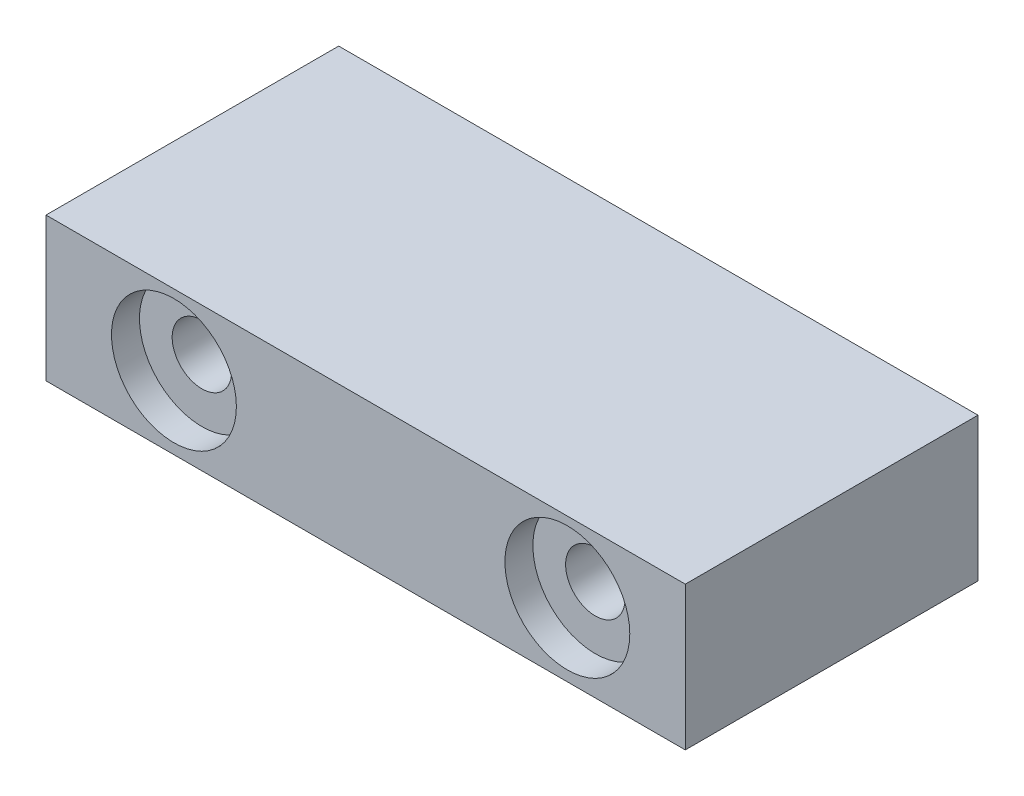
ISO-10303-21;
HEADER;
FILE_DESCRIPTION(('STEP AP214'),'2;1');
FILE_NAME('part.step','',(''),(''),'','','');
FILE_SCHEMA(('AUTOMOTIVE_DESIGN { 1 0 10303 214 1 1 1 1 }'));
ENDSEC;
DATA;
#1=APPLICATION_CONTEXT('core data for automotive mechanical design processes');
#2=APPLICATION_PROTOCOL_DEFINITION('international standard','automotive_design',2000,#1);
#3=PRODUCT_CONTEXT('',#1,'mechanical');
#4=PRODUCT('Part','Part','',(#3));
#5=PRODUCT_RELATED_PRODUCT_CATEGORY('part','',(#4));
#6=PRODUCT_DEFINITION_FORMATION('','',#4);
#7=PRODUCT_DEFINITION_CONTEXT('part definition',#1,'design');
#8=PRODUCT_DEFINITION('design','',#6,#7);
#9=PRODUCT_DEFINITION_SHAPE('','',#8);
#10=(LENGTH_UNIT() NAMED_UNIT(*) SI_UNIT(.MILLI.,.METRE.));
#11=(NAMED_UNIT(*) PLANE_ANGLE_UNIT() SI_UNIT($,.RADIAN.));
#12=(NAMED_UNIT(*) SI_UNIT($,.STERADIAN.) SOLID_ANGLE_UNIT());
#13=UNCERTAINTY_MEASURE_WITH_UNIT(LENGTH_MEASURE(1.E-05),#10,'distance_accuracy_value','');
#14=(GEOMETRIC_REPRESENTATION_CONTEXT(3) GLOBAL_UNCERTAINTY_ASSIGNED_CONTEXT((#13)) GLOBAL_UNIT_ASSIGNED_CONTEXT((#10,
#11,#12)) REPRESENTATION_CONTEXT('',''));
#15=CARTESIAN_POINT('',(0.,0.,0.));
#16=DIRECTION('',(0.,0.,1.));
#17=DIRECTION('',(1.,0.,0.));
#18=AXIS2_PLACEMENT_3D('',#15,#16,#17);
#19=CARTESIAN_POINT('',(-8.125,3.65,7.44));
#20=DIRECTION('',(0.,-1.,0.));
#21=DIRECTION('',(0.,0.,-1.));
#22=AXIS2_PLACEMENT_3D('',#19,#20,#21);
#23=PLANE('',#22);
#24=DIRECTION('',(-1.,0.,0.));
#25=VECTOR('',#24,1.);
#26=CARTESIAN_POINT('',(-8.125,3.65,0.));
#27=LINE('',#26,#25);
#28=CARTESIAN_POINT('',(8.125,3.65,0.));
#29=VERTEX_POINT('',#28);
#30=CARTESIAN_POINT('',(-8.125,3.65,0.));
#31=VERTEX_POINT('',#30);
#32=EDGE_CURVE('E135',#29,#31,#27,.T.);
#33=ORIENTED_EDGE('',*,*,#32,.T.);
#34=DIRECTION('',(0.,0.,-1.));
#35=VECTOR('',#34,1.);
#36=CARTESIAN_POINT('',(-8.125,3.65,7.44));
#37=LINE('',#36,#35);
#38=CARTESIAN_POINT('',(-8.125,3.65,7.44));
#39=VERTEX_POINT('',#38);
#40=EDGE_CURVE('E11',#39,#31,#37,.T.);
#41=ORIENTED_EDGE('',*,*,#40,.F.);
#42=DIRECTION('',(-1.,0.,0.));
#43=VECTOR('',#42,1.);
#44=CARTESIAN_POINT('',(-8.125,3.65,7.44));
#45=LINE('',#44,#43);
#46=CARTESIAN_POINT('',(8.125,3.65,7.44));
#47=VERTEX_POINT('',#46);
#48=EDGE_CURVE('E136',#47,#39,#45,.T.);
#49=ORIENTED_EDGE('',*,*,#48,.F.);
#50=DIRECTION('',(0.,0.,-1.));
#51=VECTOR('',#50,1.);
#52=CARTESIAN_POINT('',(8.125,3.65,7.44));
#53=LINE('',#52,#51);
#54=EDGE_CURVE('E146',#47,#29,#53,.T.);
#55=ORIENTED_EDGE('',*,*,#54,.T.);
#56=EDGE_LOOP('',(#33,#41,#49,#55));
#57=FACE_BOUND('',#56,.T.);
#58=ADVANCED_FACE('F45',(#57),#23,.F.);
#59=CARTESIAN_POINT('',(-8.125,3.65,7.44));
#60=DIRECTION('',(1.,0.,0.));
#61=DIRECTION('',(0.,0.,-1.));
#62=AXIS2_PLACEMENT_3D('',#59,#60,#61);
#63=PLANE('',#62);
#64=DIRECTION('',(0.,-1.,0.));
#65=VECTOR('',#64,1.);
#66=CARTESIAN_POINT('',(-8.125,3.65,0.));
#67=LINE('',#66,#65);
#68=CARTESIAN_POINT('',(-8.125,0.,0.));
#69=VERTEX_POINT('',#68);
#70=EDGE_CURVE('E150',#31,#69,#67,.T.);
#71=ORIENTED_EDGE('',*,*,#70,.T.);
#72=DIRECTION('',(0.,0.,-1.));
#73=VECTOR('',#72,1.);
#74=CARTESIAN_POINT('',(-8.125,0.,7.44));
#75=LINE('',#74,#73);
#76=CARTESIAN_POINT('',(-8.125,0.,7.44));
#77=VERTEX_POINT('',#76);
#78=EDGE_CURVE('E54',#77,#69,#75,.T.);
#79=ORIENTED_EDGE('',*,*,#78,.F.);
#80=DIRECTION('',(0.,-1.,0.));
#81=VECTOR('',#80,1.);
#82=CARTESIAN_POINT('',(-8.125,3.65,7.44));
#83=LINE('',#82,#81);
#84=EDGE_CURVE('E93',#39,#77,#83,.T.);
#85=ORIENTED_EDGE('',*,*,#84,.F.);
#86=ORIENTED_EDGE('',*,*,#40,.T.);
#87=EDGE_LOOP('',(#71,#79,#85,#86));
#88=FACE_BOUND('',#87,.T.);
#89=ADVANCED_FACE('F180',(#88),#63,.F.);
#90=CARTESIAN_POINT('',(-8.125,0.,7.44));
#91=DIRECTION('',(0.,1.,0.));
#92=DIRECTION('',(0.,0.,1.));
#93=AXIS2_PLACEMENT_3D('',#90,#91,#92);
#94=PLANE('',#93);
#95=DIRECTION('',(1.,0.,0.));
#96=VECTOR('',#95,1.);
#97=CARTESIAN_POINT('',(-8.125,0.,0.));
#98=LINE('',#97,#96);
#99=CARTESIAN_POINT('',(8.125,0.,0.));
#100=VERTEX_POINT('',#99);
#101=EDGE_CURVE('E80',#69,#100,#98,.T.);
#102=ORIENTED_EDGE('',*,*,#101,.T.);
#103=DIRECTION('',(0.,0.,-1.));
#104=VECTOR('',#103,1.);
#105=CARTESIAN_POINT('',(8.125,0.,7.44));
#106=LINE('',#105,#104);
#107=CARTESIAN_POINT('',(8.125,0.,7.44));
#108=VERTEX_POINT('',#107);
#109=EDGE_CURVE('E159',#108,#100,#106,.T.);
#110=ORIENTED_EDGE('',*,*,#109,.F.);
#111=DIRECTION('',(1.,0.,0.));
#112=VECTOR('',#111,1.);
#113=CARTESIAN_POINT('',(-8.125,0.,7.44));
#114=LINE('',#113,#112);
#115=EDGE_CURVE('E141',#77,#108,#114,.T.);
#116=ORIENTED_EDGE('',*,*,#115,.F.);
#117=ORIENTED_EDGE('',*,*,#78,.T.);
#118=EDGE_LOOP('',(#102,#110,#116,#117));
#119=FACE_BOUND('',#118,.T.);
#120=ADVANCED_FACE('F163',(#119),#94,.F.);
#121=CARTESIAN_POINT('',(8.125,3.65,7.44));
#122=DIRECTION('',(-1.,0.,0.));
#123=DIRECTION('',(0.,0.,1.));
#124=AXIS2_PLACEMENT_3D('',#121,#122,#123);
#125=PLANE('',#124);
#126=DIRECTION('',(0.,1.,0.));
#127=VECTOR('',#126,1.);
#128=CARTESIAN_POINT('',(8.125,3.65,0.));
#129=LINE('',#128,#127);
#130=EDGE_CURVE('E86',#100,#29,#129,.T.);
#131=ORIENTED_EDGE('',*,*,#130,.T.);
#132=ORIENTED_EDGE('',*,*,#54,.F.);
#133=DIRECTION('',(0.,1.,0.));
#134=VECTOR('',#133,1.);
#135=CARTESIAN_POINT('',(8.125,3.65,7.44));
#136=LINE('',#135,#134);
#137=EDGE_CURVE('E62',#108,#47,#136,.T.);
#138=ORIENTED_EDGE('',*,*,#137,.F.);
#139=ORIENTED_EDGE('',*,*,#109,.T.);
#140=EDGE_LOOP('',(#131,#132,#138,#139));
#141=FACE_BOUND('',#140,.T.);
#142=ADVANCED_FACE('F170',(#141),#125,.F.);
#143=CARTESIAN_POINT('',(0.,0.,7.44));
#144=DIRECTION('',(0.,0.,-1.));
#145=DIRECTION('',(-1.,0.,0.));
#146=AXIS2_PLACEMENT_3D('',#143,#144,#145);
#147=PLANE('',#146);
#148=CARTESIAN_POINT('',(-4.87325948348779,1.85,7.44));
#149=DIRECTION('',(0.,0.,1.));
#150=DIRECTION('',(1.,0.,0.));
#151=AXIS2_PLACEMENT_3D('',#148,#149,#150);
#152=CIRCLE('',#151,1.5875);
#153=CARTESIAN_POINT('',(-3.28575948348779,1.85,7.44));
#154=VERTEX_POINT('',#153);
#155=EDGE_CURVE('E354',#154,#154,#152,.T.);
#156=ORIENTED_EDGE('',*,*,#155,.F.);
#157=EDGE_LOOP('',(#156));
#158=FACE_BOUND('',#157,.T.);
#159=CARTESIAN_POINT('',(5.12674051651221,1.85,7.44));
#160=DIRECTION('',(0.,0.,1.));
#161=DIRECTION('',(1.,0.,0.));
#162=AXIS2_PLACEMENT_3D('',#159,#160,#161);
#163=CIRCLE('',#162,1.5875);
#164=CARTESIAN_POINT('',(6.71424051651221,1.85,7.44));
#165=VERTEX_POINT('',#164);
#166=EDGE_CURVE('E111',#165,#165,#163,.T.);
#167=ORIENTED_EDGE('',*,*,#166,.F.);
#168=EDGE_LOOP('',(#167));
#169=FACE_BOUND('',#168,.T.);
#170=ORIENTED_EDGE('',*,*,#48,.T.);
#171=ORIENTED_EDGE('',*,*,#84,.T.);
#172=ORIENTED_EDGE('',*,*,#115,.T.);
#173=ORIENTED_EDGE('',*,*,#137,.T.);
#174=EDGE_LOOP('',(#170,#171,#172,#173));
#175=FACE_BOUND('',#174,.T.);
#176=ADVANCED_FACE('F172',(#158,#169,#175),#147,.F.);
#177=CARTESIAN_POINT('',(0.,0.,0.));
#178=DIRECTION('',(0.,0.,-1.));
#179=DIRECTION('',(-1.,0.,0.));
#180=AXIS2_PLACEMENT_3D('',#177,#178,#179);
#181=PLANE('',#180);
#182=ORIENTED_EDGE('',*,*,#32,.F.);
#183=ORIENTED_EDGE('',*,*,#130,.F.);
#184=ORIENTED_EDGE('',*,*,#101,.F.);
#185=ORIENTED_EDGE('',*,*,#70,.F.);
#186=EDGE_LOOP('',(#182,#183,#184,#185));
#187=FACE_BOUND('',#186,.T.);
#188=ADVANCED_FACE('F166',(#187),#181,.T.);
#189=CARTESIAN_POINT('',(5.12674051651221,1.85,2.44));
#190=DIRECTION('',(0.,0.,1.));
#191=DIRECTION('',(1.,0.,0.));
#192=AXIS2_PLACEMENT_3D('',#189,#190,#191);
#193=CONICAL_SURFACE('',#192,0.755649999999998,1.02974425867665);
#194=CARTESIAN_POINT('',(5.12674051651221,1.85,1.98595967323182));
#195=VERTEX_POINT('',#194);
#196=VERTEX_LOOP('',#195);
#197=FACE_BOUND('',#196,.T.);
#198=CARTESIAN_POINT('',(5.12674051651221,1.85,2.44));
#199=DIRECTION('',(0.,0.,1.));
#200=DIRECTION('',(1.,0.,0.));
#201=AXIS2_PLACEMENT_3D('',#198,#199,#200);
#202=CIRCLE('',#201,0.755649999999998);
#203=CARTESIAN_POINT('',(5.88239051651221,1.85,2.44));
#204=VERTEX_POINT('',#203);
#205=EDGE_CURVE('E131',#204,#204,#202,.T.);
#206=ORIENTED_EDGE('',*,*,#205,.T.);
#207=EDGE_LOOP('',(#206));
#208=FACE_BOUND('',#207,.T.);
#209=ADVANCED_FACE('F213',(#197,#208),#193,.F.);
#210=CARTESIAN_POINT('',(5.12674051651221,1.85,7.44));
#211=DIRECTION('',(0.,0.,1.));
#212=DIRECTION('',(1.,0.,0.));
#213=AXIS2_PLACEMENT_3D('',#210,#211,#212);
#214=CYLINDRICAL_SURFACE('',#213,0.755649999999999);
#215=ORIENTED_EDGE('',*,*,#205,.F.);
#216=EDGE_LOOP('',(#215));
#217=FACE_BOUND('',#216,.T.);
#218=CARTESIAN_POINT('',(5.12674051651221,1.85,6.7288));
#219=DIRECTION('',(0.,0.,1.));
#220=DIRECTION('',(1.,0.,0.));
#221=AXIS2_PLACEMENT_3D('',#218,#219,#220);
#222=CIRCLE('',#221,0.755649999999999);
#223=CARTESIAN_POINT('',(5.88239051651221,1.85,6.7288));
#224=VERTEX_POINT('',#223);
#225=EDGE_CURVE('E127',#224,#224,#222,.T.);
#226=ORIENTED_EDGE('',*,*,#225,.T.);
#227=EDGE_LOOP('',(#226));
#228=FACE_BOUND('',#227,.T.);
#229=ADVANCED_FACE('F220',(#217,#228),#214,.F.);
#230=CARTESIAN_POINT('',(5.88239051651221,1.85,6.7288));
#231=DIRECTION('',(0.,0.,-1.));
#232=DIRECTION('',(-1.,0.,0.));
#233=AXIS2_PLACEMENT_3D('',#230,#231,#232);
#234=PLANE('',#233);
#235=ORIENTED_EDGE('',*,*,#225,.F.);
#236=EDGE_LOOP('',(#235));
#237=FACE_BOUND('',#236,.T.);
#238=CARTESIAN_POINT('',(5.12674051651221,1.85,6.7288));
#239=DIRECTION('',(0.,0.,1.));
#240=DIRECTION('',(1.,0.,0.));
#241=AXIS2_PLACEMENT_3D('',#238,#239,#240);
#242=CIRCLE('',#241,1.5875);
#243=CARTESIAN_POINT('',(6.71424051651221,1.85,6.7288));
#244=VERTEX_POINT('',#243);
#245=EDGE_CURVE('E117',#244,#244,#242,.T.);
#246=ORIENTED_EDGE('',*,*,#245,.T.);
#247=EDGE_LOOP('',(#246));
#248=FACE_BOUND('',#247,.T.);
#249=ADVANCED_FACE('F230',(#237,#248),#234,.F.);
#250=CARTESIAN_POINT('',(5.12674051651221,1.85,7.44));
#251=DIRECTION('',(0.,0.,1.));
#252=DIRECTION('',(1.,0.,0.));
#253=AXIS2_PLACEMENT_3D('',#250,#251,#252);
#254=CYLINDRICAL_SURFACE('',#253,1.5875);
#255=ORIENTED_EDGE('',*,*,#245,.F.);
#256=EDGE_LOOP('',(#255));
#257=FACE_BOUND('',#256,.T.);
#258=ORIENTED_EDGE('',*,*,#166,.T.);
#259=EDGE_LOOP('',(#258));
#260=FACE_BOUND('',#259,.T.);
#261=ADVANCED_FACE('F104',(#257,#260),#254,.F.);
#262=CARTESIAN_POINT('',(-4.87325948348779,1.85,2.44));
#263=DIRECTION('',(0.,0.,1.));
#264=DIRECTION('',(1.,0.,0.));
#265=AXIS2_PLACEMENT_3D('',#262,#263,#264);
#266=CONICAL_SURFACE('',#265,0.755649999999998,1.02974425867665);
#267=CARTESIAN_POINT('',(-4.87325948348779,1.85,1.98595967323182));
#268=VERTEX_POINT('',#267);
#269=VERTEX_LOOP('',#268);
#270=FACE_BOUND('',#269,.T.);
#271=CARTESIAN_POINT('',(-4.87325948348779,1.85,2.44));
#272=DIRECTION('',(0.,0.,1.));
#273=DIRECTION('',(1.,0.,0.));
#274=AXIS2_PLACEMENT_3D('',#271,#272,#273);
#275=CIRCLE('',#274,0.755649999999998);
#276=CARTESIAN_POINT('',(-4.11760948348779,1.85,2.44));
#277=VERTEX_POINT('',#276);
#278=EDGE_CURVE('E108',#277,#277,#275,.T.);
#279=ORIENTED_EDGE('',*,*,#278,.T.);
#280=EDGE_LOOP('',(#279));
#281=FACE_BOUND('',#280,.T.);
#282=ADVANCED_FACE('F100',(#270,#281),#266,.F.);
#283=CARTESIAN_POINT('',(-4.87325948348779,1.85,7.44));
#284=DIRECTION('',(0.,0.,1.));
#285=DIRECTION('',(1.,0.,0.));
#286=AXIS2_PLACEMENT_3D('',#283,#284,#285);
#287=CYLINDRICAL_SURFACE('',#286,0.755649999999999);
#288=ORIENTED_EDGE('',*,*,#278,.F.);
#289=EDGE_LOOP('',(#288));
#290=FACE_BOUND('',#289,.T.);
#291=CARTESIAN_POINT('',(-4.87325948348779,1.85,6.7288));
#292=DIRECTION('',(0.,0.,1.));
#293=DIRECTION('',(1.,0.,0.));
#294=AXIS2_PLACEMENT_3D('',#291,#292,#293);
#295=CIRCLE('',#294,0.755649999999999);
#296=CARTESIAN_POINT('',(-4.11760948348779,1.85,6.7288));
#297=VERTEX_POINT('',#296);
#298=EDGE_CURVE('E112',#297,#297,#295,.T.);
#299=ORIENTED_EDGE('',*,*,#298,.T.);
#300=EDGE_LOOP('',(#299));
#301=FACE_BOUND('',#300,.T.);
#302=ADVANCED_FACE('F103',(#290,#301),#287,.F.);
#303=CARTESIAN_POINT('',(-4.11760948348779,1.85,6.7288));
#304=DIRECTION('',(0.,0.,-1.));
#305=DIRECTION('',(-1.,0.,0.));
#306=AXIS2_PLACEMENT_3D('',#303,#304,#305);
#307=PLANE('',#306);
#308=ORIENTED_EDGE('',*,*,#298,.F.);
#309=EDGE_LOOP('',(#308));
#310=FACE_BOUND('',#309,.T.);
#311=CARTESIAN_POINT('',(-4.87325948348779,1.85,6.7288));
#312=DIRECTION('',(0.,0.,1.));
#313=DIRECTION('',(1.,0.,0.));
#314=AXIS2_PLACEMENT_3D('',#311,#312,#313);
#315=CIRCLE('',#314,1.5875);
#316=CARTESIAN_POINT('',(-3.28575948348779,1.85,6.7288));
#317=VERTEX_POINT('',#316);
#318=EDGE_CURVE('E120',#317,#317,#315,.T.);
#319=ORIENTED_EDGE('',*,*,#318,.T.);
#320=EDGE_LOOP('',(#319));
#321=FACE_BOUND('',#320,.T.);
#322=ADVANCED_FACE('F264',(#310,#321),#307,.F.);
#323=CARTESIAN_POINT('',(-4.87325948348779,1.85,7.44));
#324=DIRECTION('',(0.,0.,1.));
#325=DIRECTION('',(1.,0.,0.));
#326=AXIS2_PLACEMENT_3D('',#323,#324,#325);
#327=CYLINDRICAL_SURFACE('',#326,1.5875);
#328=ORIENTED_EDGE('',*,*,#318,.F.);
#329=EDGE_LOOP('',(#328));
#330=FACE_BOUND('',#329,.T.);
#331=ORIENTED_EDGE('',*,*,#155,.T.);
#332=EDGE_LOOP('',(#331));
#333=FACE_BOUND('',#332,.T.);
#334=ADVANCED_FACE('F273',(#330,#333),#327,.F.);
#335=CLOSED_SHELL('',(#58,#89,#120,#142,#176,#188,#209,#229,#249,#261,#282,#302,#322,#334));
#336=MANIFOLD_SOLID_BREP('B2',#335);
#337=ADVANCED_BREP_SHAPE_REPRESENTATION('',(#18,#336),#14);
#338=SHAPE_DEFINITION_REPRESENTATION(#9,#337);
ENDSEC;
END-ISO-10303-21;
